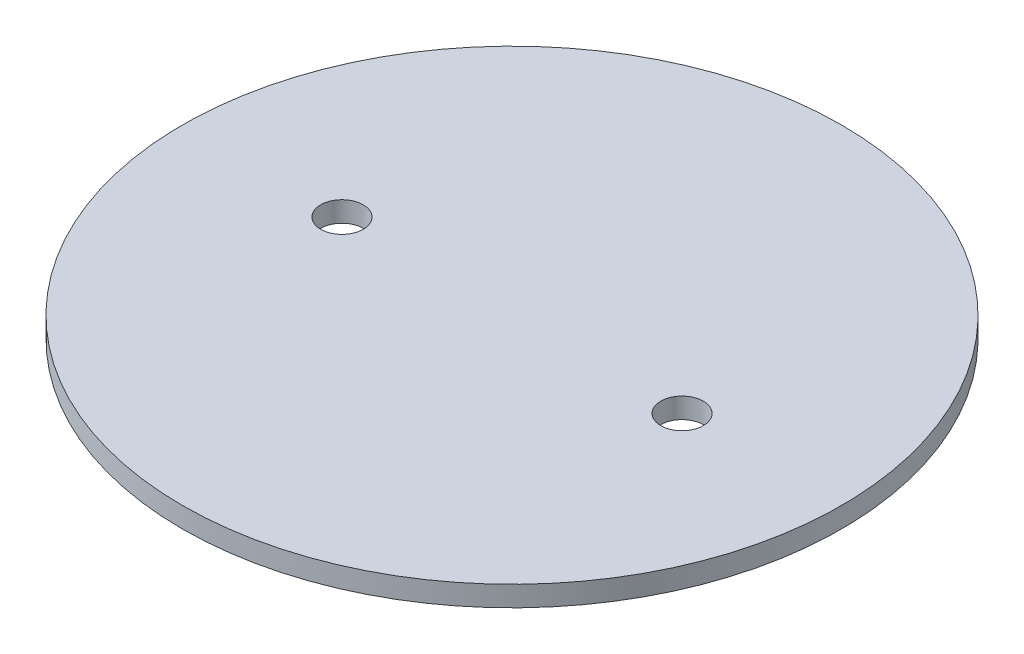
ISO-10303-21;
HEADER;
FILE_DESCRIPTION(('STEP AP214'),'2;1');
FILE_NAME('part.step','',(''),(''),'','','');
FILE_SCHEMA(('AUTOMOTIVE_DESIGN { 1 0 10303 214 1 1 1 1 }'));
ENDSEC;
DATA;
#1=APPLICATION_CONTEXT('core data for automotive mechanical design processes');
#2=APPLICATION_PROTOCOL_DEFINITION('international standard','automotive_design',2000,#1);
#3=PRODUCT_CONTEXT('',#1,'mechanical');
#4=PRODUCT('Part','Part','',(#3));
#5=PRODUCT_RELATED_PRODUCT_CATEGORY('part','',(#4));
#6=PRODUCT_DEFINITION_FORMATION('','',#4);
#7=PRODUCT_DEFINITION_CONTEXT('part definition',#1,'design');
#8=PRODUCT_DEFINITION('design','',#6,#7);
#9=PRODUCT_DEFINITION_SHAPE('','',#8);
#10=(LENGTH_UNIT() NAMED_UNIT(*) SI_UNIT(.MILLI.,.METRE.));
#11=(NAMED_UNIT(*) PLANE_ANGLE_UNIT() SI_UNIT($,.RADIAN.));
#12=(NAMED_UNIT(*) SI_UNIT($,.STERADIAN.) SOLID_ANGLE_UNIT());
#13=UNCERTAINTY_MEASURE_WITH_UNIT(LENGTH_MEASURE(1.E-05),#10,'distance_accuracy_value','');
#14=(GEOMETRIC_REPRESENTATION_CONTEXT(3) GLOBAL_UNCERTAINTY_ASSIGNED_CONTEXT((#13)) GLOBAL_UNIT_ASSIGNED_CONTEXT((#10,
#11,#12)) REPRESENTATION_CONTEXT('',''));
#15=CARTESIAN_POINT('',(0.,0.,0.));
#16=DIRECTION('',(0.,0.,1.));
#17=DIRECTION('',(1.,0.,0.));
#18=AXIS2_PLACEMENT_3D('',#15,#16,#17);
#19=CARTESIAN_POINT('',(0.,3.,0.));
#20=DIRECTION('',(0.,1.,0.));
#21=DIRECTION('',(0.,0.,1.));
#22=AXIS2_PLACEMENT_3D('',#19,#20,#21);
#23=PLANE('',#22);
#24=CARTESIAN_POINT('',(-50.,3.,0.));
#25=DIRECTION('',(0.,1.,0.));
#26=DIRECTION('',(0.,0.,1.));
#27=AXIS2_PLACEMENT_3D('',#24,#25,#26);
#28=CIRCLE('',#27,6.25);
#29=CARTESIAN_POINT('',(-50.,3.,6.25));
#30=VERTEX_POINT('',#29);
#31=EDGE_CURVE('E42',#30,#30,#28,.T.);
#32=ORIENTED_EDGE('',*,*,#31,.F.);
#33=EDGE_LOOP('',(#32));
#34=FACE_BOUND('',#33,.T.);
#35=CARTESIAN_POINT('',(0.,3.,0.));
#36=DIRECTION('',(0.,1.,0.));
#37=DIRECTION('',(0.,0.,1.));
#38=AXIS2_PLACEMENT_3D('',#35,#36,#37);
#39=CIRCLE('',#38,96.9);
#40=CARTESIAN_POINT('',(0.,3.,96.9));
#41=VERTEX_POINT('',#40);
#42=EDGE_CURVE('E10',#41,#41,#39,.T.);
#43=ORIENTED_EDGE('',*,*,#42,.T.);
#44=EDGE_LOOP('',(#43));
#45=FACE_BOUND('',#44,.T.);
#46=CARTESIAN_POINT('',(50.,3.,0.));
#47=DIRECTION('',(0.,1.,0.));
#48=DIRECTION('',(0.,0.,1.));
#49=AXIS2_PLACEMENT_3D('',#46,#47,#48);
#50=CIRCLE('',#49,6.25000000000001);
#51=CARTESIAN_POINT('',(50.,3.,6.25000000000001));
#52=VERTEX_POINT('',#51);
#53=EDGE_CURVE('E47',#52,#52,#50,.T.);
#54=ORIENTED_EDGE('',*,*,#53,.F.);
#55=EDGE_LOOP('',(#54));
#56=FACE_BOUND('',#55,.T.);
#57=ADVANCED_FACE('F31',(#34,#45,#56),#23,.T.);
#58=CARTESIAN_POINT('',(0.,-3.,0.));
#59=DIRECTION('',(0.,1.,0.));
#60=DIRECTION('',(0.,0.,1.));
#61=AXIS2_PLACEMENT_3D('',#58,#59,#60);
#62=PLANE('',#61);
#63=CARTESIAN_POINT('',(0.,-3.,0.));
#64=DIRECTION('',(0.,1.,0.));
#65=DIRECTION('',(0.,0.,1.));
#66=AXIS2_PLACEMENT_3D('',#63,#64,#65);
#67=CIRCLE('',#66,96.9);
#68=CARTESIAN_POINT('',(0.,-3.,96.9));
#69=VERTEX_POINT('',#68);
#70=EDGE_CURVE('E35',#69,#69,#67,.T.);
#71=ORIENTED_EDGE('',*,*,#70,.F.);
#72=EDGE_LOOP('',(#71));
#73=FACE_BOUND('',#72,.T.);
#74=CARTESIAN_POINT('',(-50.,-3.,0.));
#75=DIRECTION('',(0.,1.,0.));
#76=DIRECTION('',(0.,0.,1.));
#77=AXIS2_PLACEMENT_3D('',#74,#75,#76);
#78=CIRCLE('',#77,6.25);
#79=CARTESIAN_POINT('',(-50.,-3.,6.25));
#80=VERTEX_POINT('',#79);
#81=EDGE_CURVE('E44',#80,#80,#78,.T.);
#82=ORIENTED_EDGE('',*,*,#81,.T.);
#83=EDGE_LOOP('',(#82));
#84=FACE_BOUND('',#83,.T.);
#85=CARTESIAN_POINT('',(50.,-3.,0.));
#86=DIRECTION('',(0.,1.,0.));
#87=DIRECTION('',(0.,0.,1.));
#88=AXIS2_PLACEMENT_3D('',#85,#86,#87);
#89=CIRCLE('',#88,6.25000000000001);
#90=CARTESIAN_POINT('',(50.,-3.,6.25000000000001));
#91=VERTEX_POINT('',#90);
#92=EDGE_CURVE('E50',#91,#91,#89,.T.);
#93=ORIENTED_EDGE('',*,*,#92,.T.);
#94=EDGE_LOOP('',(#93));
#95=FACE_BOUND('',#94,.T.);
#96=ADVANCED_FACE('F60',(#73,#84,#95),#62,.F.);
#97=CARTESIAN_POINT('',(0.,3.,0.));
#98=DIRECTION('',(0.,-1.,0.));
#99=DIRECTION('',(0.,0.,-1.));
#100=AXIS2_PLACEMENT_3D('',#97,#98,#99);
#101=CYLINDRICAL_SURFACE('',#100,96.9);
#102=ORIENTED_EDGE('',*,*,#42,.F.);
#103=EDGE_LOOP('',(#102));
#104=FACE_BOUND('',#103,.T.);
#105=ORIENTED_EDGE('',*,*,#70,.T.);
#106=EDGE_LOOP('',(#105));
#107=FACE_BOUND('',#106,.T.);
#108=ADVANCED_FACE('F33',(#104,#107),#101,.T.);
#109=CARTESIAN_POINT('',(-50.,3.,0.));
#110=DIRECTION('',(0.,-1.,0.));
#111=DIRECTION('',(0.,0.,-1.));
#112=AXIS2_PLACEMENT_3D('',#109,#110,#111);
#113=CYLINDRICAL_SURFACE('',#112,6.25);
#114=ORIENTED_EDGE('',*,*,#31,.T.);
#115=EDGE_LOOP('',(#114));
#116=FACE_BOUND('',#115,.T.);
#117=ORIENTED_EDGE('',*,*,#81,.F.);
#118=EDGE_LOOP('',(#117));
#119=FACE_BOUND('',#118,.T.);
#120=ADVANCED_FACE('F69',(#116,#119),#113,.F.);
#121=CARTESIAN_POINT('',(50.,3.,0.));
#122=DIRECTION('',(0.,-1.,0.));
#123=DIRECTION('',(0.,0.,-1.));
#124=AXIS2_PLACEMENT_3D('',#121,#122,#123);
#125=CYLINDRICAL_SURFACE('',#124,6.25000000000001);
#126=ORIENTED_EDGE('',*,*,#53,.T.);
#127=EDGE_LOOP('',(#126));
#128=FACE_BOUND('',#127,.T.);
#129=ORIENTED_EDGE('',*,*,#92,.F.);
#130=EDGE_LOOP('',(#129));
#131=FACE_BOUND('',#130,.T.);
#132=ADVANCED_FACE('F56',(#128,#131),#125,.F.);
#133=CLOSED_SHELL('',(#57,#96,#108,#120,#132));
#134=MANIFOLD_SOLID_BREP('B2',#133);
#135=ADVANCED_BREP_SHAPE_REPRESENTATION('',(#18,#134),#14);
#136=SHAPE_DEFINITION_REPRESENTATION(#9,#135);
ENDSEC;
END-ISO-10303-21;
